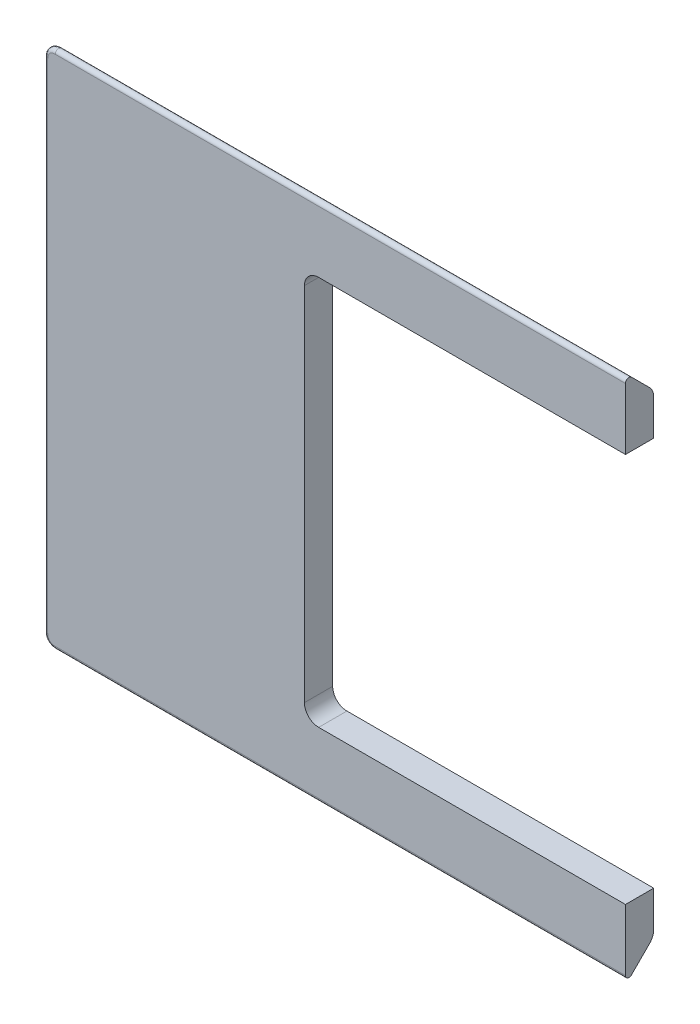
ISO-10303-21;
HEADER;
FILE_DESCRIPTION(('STEP AP214'),'2;1');
FILE_NAME('part.step','',(''),(''),'','','');
FILE_SCHEMA(('AUTOMOTIVE_DESIGN { 1 0 10303 214 1 1 1 1 }'));
ENDSEC;
DATA;
#1=APPLICATION_CONTEXT('core data for automotive mechanical design processes');
#2=APPLICATION_PROTOCOL_DEFINITION('international standard','automotive_design',2000,#1);
#3=PRODUCT_CONTEXT('',#1,'mechanical');
#4=PRODUCT('Part','Part','',(#3));
#5=PRODUCT_RELATED_PRODUCT_CATEGORY('part','',(#4));
#6=PRODUCT_DEFINITION_FORMATION('','',#4);
#7=PRODUCT_DEFINITION_CONTEXT('part definition',#1,'design');
#8=PRODUCT_DEFINITION('design','',#6,#7);
#9=PRODUCT_DEFINITION_SHAPE('','',#8);
#10=(LENGTH_UNIT() NAMED_UNIT(*) SI_UNIT(.MILLI.,.METRE.));
#11=(NAMED_UNIT(*) PLANE_ANGLE_UNIT() SI_UNIT($,.RADIAN.));
#12=(NAMED_UNIT(*) SI_UNIT($,.STERADIAN.) SOLID_ANGLE_UNIT());
#13=UNCERTAINTY_MEASURE_WITH_UNIT(LENGTH_MEASURE(1.E-05),#10,'distance_accuracy_value','');
#14=(GEOMETRIC_REPRESENTATION_CONTEXT(3) GLOBAL_UNCERTAINTY_ASSIGNED_CONTEXT((#13)) GLOBAL_UNIT_ASSIGNED_CONTEXT((#10,
#11,#12)) REPRESENTATION_CONTEXT('',''));
#15=CARTESIAN_POINT('',(0.,0.,0.));
#16=DIRECTION('',(0.,0.,1.));
#17=DIRECTION('',(1.,0.,0.));
#18=AXIS2_PLACEMENT_3D('',#15,#16,#17);
#19=CARTESIAN_POINT('',(-3.00496428663334,-69.8231491568325,36.6728417155403));
#20=CARTESIAN_POINT('',(-3.0049642866328,-69.6417599665671,36.6728417155394));
#21=CARTESIAN_POINT('',(-2.94169411988399,-69.3107853670417,36.6728417155379));
#22=CARTESIAN_POINT('',(-2.62026495891638,-68.8928204622767,36.6728417155359));
#23=CARTESIAN_POINT('',(-2.22699450196718,-68.7730955867716,36.6728417155354));
#24=CARTESIAN_POINT('',(-1.95491071656874,-68.7730955867714,36.6728417155354));
#25=CARTESIAN_POINT('',(-3.11604202688526,-69.8231491568321,36.6728417155403));
#26=CARTESIAN_POINT('',(-3.11874544267914,-69.6289801714833,36.6728860846063));
#27=CARTESIAN_POINT('',(-3.05717731561895,-69.2651335654739,36.6729506764739));
#28=CARTESIAN_POINT('',(-2.68916523885976,-68.7830387092416,36.6729798260699));
#29=CARTESIAN_POINT('',(-2.24616419459224,-68.6579627228283,36.6729082691352));
#30=CARTESIAN_POINT('',(-1.95491071656882,-68.6620178465197,36.6728417155349));
#31=CARTESIAN_POINT('',(-3.33797296559265,-69.8231491568319,36.595153565734));
#32=CARTESIAN_POINT('',(-3.34607701863612,-69.6034179349615,36.5911989278276));
#33=CARTESIAN_POINT('',(-3.28797598094053,-69.1739449843441,36.5842014219234));
#34=CARTESIAN_POINT('',(-2.82680672200666,-68.5636316265411,36.5812229193344));
#35=CARTESIAN_POINT('',(-2.28450754937456,-68.4279308282474,36.5892216088699));
#36=CARTESIAN_POINT('',(-1.95491071656898,-68.4400869078132,36.5951535657278));
#37=CARTESIAN_POINT('',(-3.50968083144635,-69.8231491568326,36.3215003048124));
#38=CARTESIAN_POINT('',(-3.51571206277398,-69.5836147494334,36.3059013845933));
#39=CARTESIAN_POINT('',(-3.44727777278209,-69.1085180758411,36.2790321294264));
#40=CARTESIAN_POINT('',(-2.92049494913923,-68.4159585207845,36.2678463301518));
#41=CARTESIAN_POINT('',(-2.31421232766808,-68.2593321949684,36.2981019244797));
#42=CARTESIAN_POINT('',(-1.9549107165691,-68.2683790419606,36.3215003048065));
#43=CARTESIAN_POINT('',(-3.5009973500986,-69.823149156834,36.0348337081705));
#44=CARTESIAN_POINT('',(-3.49552275177714,-69.5846419368623,36.0120697821309));
#45=CARTESIAN_POINT('',(-3.40415970385293,-69.121168241449,35.9747058155872));
#46=CARTESIAN_POINT('',(-2.89268977031777,-68.4633909706156,35.9597698201485));
#47=CARTESIAN_POINT('',(-2.31267154652697,-68.28527442079,36.0006878191078));
#48=CARTESIAN_POINT('',(-1.95491071656909,-68.2770625233087,36.0348337081653));
#49=CARTESIAN_POINT('',(-3.41389001084896,-69.8231491568349,35.8867317263812));
#50=CARTESIAN_POINT('',(-3.39859972627252,-69.5946289625485,35.8646262894568));
#51=CARTESIAN_POINT('',(-3.29151917534255,-69.1630700849447,35.8304125853742));
#52=CARTESIAN_POINT('',(-2.8240975646465,-68.5744360054401,35.817462641883));
#53=CARTESIAN_POINT('',(-2.29769100799933,-68.3871052894218,35.8535735709916));
#54=CARTESIAN_POINT('',(-1.95491071656903,-68.3641698625581,35.8867317263763));
#55=CARTESIAN_POINT('',(-3.3549821433207,-69.8231491568354,35.827823858853));
#56=CARTESIAN_POINT('',(-3.33482778884606,-69.6014512576221,35.8076695043779));
#57=CARTESIAN_POINT('',(-3.22072262953946,-69.1898967285637,35.7779245674011));
#58=CARTESIAN_POINT('',(-2.78142422116171,-68.6433363826317,35.7671983736439));
#59=CARTESIAN_POINT('',(-2.28745756538958,-68.4533092617972,35.7975923271375));
#60=CARTESIAN_POINT('',(-1.95491071656899,-68.4230777300862,35.8278238588482));
#61=B_SPLINE_SURFACE_WITH_KNOTS('',3,3,((#19,#20,#21,#22,#23,#24),(#25,#26,#27,#28,#29,#30),
(#31,#32,#33,#34,#35,#36),(#37,#38,#39,#40,#41,#42),(#43,#44,#45,#46,#47,#48),(#49,#50,#51,#52,
#53,#54),(#55,#56,#57,#58,#59,#60)),.UNSPECIFIED.,.F.,.F.,.F.,(4,1,1,1,4),(4,1,1,4),(0.,
0.285714285714286,0.571428571428571,0.785714285714286,1.),(-0.523598775597764,
-0.224399475255628,0.0747998250865082,0.523598775599713),.UNSPECIFIED.);
#62=CARTESIAN_POINT('',(-3.00496428663334,-69.8231491568325,36.6728417155403));
#63=CARTESIAN_POINT('',(-3.0049642866328,-69.6417599665671,36.6728417155394));
#64=CARTESIAN_POINT('',(-2.94169411988399,-69.3107853670417,36.6728417155379));
#65=CARTESIAN_POINT('',(-2.62026495891638,-68.8928204622767,36.6728417155359));
#66=CARTESIAN_POINT('',(-2.22699450196718,-68.7730955867716,36.6728417155354));
#67=CARTESIAN_POINT('',(-1.95491071656874,-68.7730955867714,36.6728417155354));
#68=B_SPLINE_CURVE_WITH_KNOTS('',3,(#62,#63,#64,#65,#66,#67),.UNSPECIFIED.,.F.,.F.,(4,1,1,4),
(-0.523598775597764,-0.224399475255628,0.0747998250865082,0.523598775599713),.UNSPECIFIED.);
#69=CARTESIAN_POINT('',(-1.95491071656881,-68.7730955867729,36.6728417155354));
#70=VERTEX_POINT('',#69);
#71=CARTESIAN_POINT('',(-3.00496428663383,-69.8231491568325,36.6728417155403));
#72=VERTEX_POINT('',#71);
#73=EDGE_CURVE('E481',#70,#72,#68,.F.);
#74=CARTESIAN_POINT('',(-1.95491071656874,-68.7730955867714,36.6728417155354));
#75=CARTESIAN_POINT('',(-1.95491071656882,-68.6620178465197,36.6728417155349));
#76=CARTESIAN_POINT('',(-1.95491071656898,-68.4400869078132,36.5951535657278));
#77=CARTESIAN_POINT('',(-1.9549107165691,-68.2683790419606,36.3215003048065));
#78=CARTESIAN_POINT('',(-1.95491071656909,-68.2770625233087,36.0348337081653));
#79=CARTESIAN_POINT('',(-1.95491071656903,-68.3641698625581,35.8867317263763));
#80=CARTESIAN_POINT('',(-1.95491071656899,-68.4230777300862,35.8278238588482));
#81=B_SPLINE_CURVE_WITH_KNOTS('',3,(#74,#75,#76,#77,#78,#79,#80),.UNSPECIFIED.,.F.,.F.,(4,1,1,1,
4),(0.,0.285714285714286,0.571428571428571,0.785714285714286,1.),.UNSPECIFIED.);
#82=CARTESIAN_POINT('',(-1.9549107165689,-68.423077730088,35.8278238588481));
#83=VERTEX_POINT('',#82);
#84=EDGE_CURVE('E338',#83,#70,#81,.F.);
#85=CARTESIAN_POINT('',(-1.95491071656899,-68.4230777300862,35.8278238588482));
#86=CARTESIAN_POINT('',(-2.28745756538958,-68.4533092617972,35.7975923271375));
#87=CARTESIAN_POINT('',(-2.78142422116171,-68.6433363826317,35.7671983736439));
#88=CARTESIAN_POINT('',(-3.22072262953946,-69.1898967285637,35.7779245674011));
#89=CARTESIAN_POINT('',(-3.33482778884606,-69.6014512576221,35.8076695043779));
#90=CARTESIAN_POINT('',(-3.3549821433207,-69.8231491568354,35.827823858853));
#91=B_SPLINE_CURVE_WITH_KNOTS('',3,(#85,#86,#87,#88,#89,#90),.UNSPECIFIED.,.F.,.F.,(4,1,1,4),
(-0.523598775597764,-0.0747998250845592,0.224399475257577,0.523598775599713),.UNSPECIFIED.);
#92=CARTESIAN_POINT('',(-3.35498214334945,-69.82314915678,35.8278238588801));
#93=VERTEX_POINT('',#92);
#94=EDGE_CURVE('E482',#93,#83,#91,.F.);
#95=CARTESIAN_POINT('',(-3.3549821433207,-69.8231491568354,35.827823858853));
#96=CARTESIAN_POINT('',(-3.41389001084896,-69.8231491568349,35.8867317263812));
#97=CARTESIAN_POINT('',(-3.5009973500986,-69.823149156834,36.0348337081705));
#98=CARTESIAN_POINT('',(-3.50968083144635,-69.8231491568326,36.3215003048124));
#99=CARTESIAN_POINT('',(-3.33797296559265,-69.8231491568319,36.595153565734));
#100=CARTESIAN_POINT('',(-3.11604202688526,-69.8231491568321,36.6728417155403));
#101=CARTESIAN_POINT('',(-3.00496428663334,-69.8231491568325,36.6728417155403));
#102=B_SPLINE_CURVE_WITH_KNOTS('',3,(#95,#96,#97,#98,#99,#100,#101),.UNSPECIFIED.,.F.,.F.,(4,1,
1,1,4),(0.,0.214285714285714,0.428571428571429,0.714285714285714,1.),.UNSPECIFIED.);
#103=EDGE_CURVE('E479',#72,#93,#102,.F.);
#104=ORIENTED_EDGE('',*,*,#73,.F.);
#105=ORIENTED_EDGE('',*,*,#84,.F.);
#106=ORIENTED_EDGE('',*,*,#94,.F.);
#107=ORIENTED_EDGE('',*,*,#103,.F.);
#108=EDGE_LOOP('',(#104,#105,#106,#107));
#109=FACE_BOUND('',#108,.T.);
#110=ADVANCED_FACE('F17',(#109),#61,.F.);
#111=CARTESIAN_POINT('',(0.580142853498731,-72.3582027269058,34.6928417155298));
#112=DIRECTION('',(-0.270598050073099,0.270598050073099,-0.923879532511287));
#113=DIRECTION('',(0.959682982260667,0.,-0.281084637714821));
#114=AXIS2_PLACEMENT_3D('',#111,#112,#113);
#115=SPHERICAL_SURFACE('',#114,1.98);
#116=CARTESIAN_POINT('',(0.0443587143539955,-71.8224185877611,32.8635602411575));
#117=VERTEX_POINT('',#116);
#118=VERTEX_LOOP('',#117);
#119=FACE_BOUND('',#118,.T.);
#120=CARTESIAN_POINT('',(0.580142853498731,-72.3582027269058,34.6928417155298));
#121=DIRECTION('',(1.,0.,0.));
#122=DIRECTION('',(0.,0.,-1.));
#123=AXIS2_PLACEMENT_3D('',#120,#121,#122);
#124=CIRCLE('',#123,1.98);
#125=CARTESIAN_POINT('',(0.580142853498721,-70.9581313001564,33.2927702887805));
#126=VERTEX_POINT('',#125);
#127=CARTESIAN_POINT('',(0.580142853498731,-72.3582027269058,32.7128417155298));
#128=VERTEX_POINT('',#127);
#129=EDGE_CURVE('E24',#126,#128,#124,.F.);
#130=ORIENTED_EDGE('',*,*,#129,.T.);
#131=CARTESIAN_POINT('',(0.580142853498731,-72.3582027269058,34.6928417155298));
#132=DIRECTION('',(0.,-1.,0.));
#133=DIRECTION('',(0.,0.,-1.));
#134=AXIS2_PLACEMENT_3D('',#131,#132,#133);
#135=CIRCLE('',#134,1.98);
#136=CARTESIAN_POINT('',(-0.819928573250653,-72.3582027269058,33.2927702887805));
#137=VERTEX_POINT('',#136);
#138=EDGE_CURVE('E500',#128,#137,#135,.F.);
#139=ORIENTED_EDGE('',*,*,#138,.T.);
#140=CARTESIAN_POINT('',(0.580142853498698,-72.3582027269058,34.6928417155298));
#141=DIRECTION('',(0.577350269189626,-0.577350269189625,-0.577350269189626));
#142=DIRECTION('',(-0.707106781186547,0.,-0.707106781186547));
#143=AXIS2_PLACEMENT_3D('',#140,#141,#142);
#144=CIRCLE('',#143,1.98);
#145=EDGE_CURVE('E485',#126,#137,#144,.F.);
#146=ORIENTED_EDGE('',*,*,#145,.F.);
#147=EDGE_LOOP('',(#130,#139,#146));
#148=FACE_BOUND('',#147,.T.);
#149=ADVANCED_FACE('F301',(#119,#148),#115,.T.);
#150=CARTESIAN_POINT('',(-1.95491071690341,-140.633024160384,36.6728417158714));
#151=CARTESIAN_POINT('',(-2.22699450230281,-140.633024160384,36.6728417158714));
#152=CARTESIAN_POINT('',(-2.62025383510631,-140.513284038942,36.6728417158709));
#153=CARTESIAN_POINT('',(-2.94168802214441,-140.095326470196,36.6728417158689));
#154=CARTESIAN_POINT('',(-3.00496428696518,-139.764359780586,36.6728417158673));
#155=CARTESIAN_POINT('',(-3.00496428696446,-139.582970590319,36.6728417158665));
#156=CARTESIAN_POINT('',(-1.95491071690321,-140.744101900636,36.6728417158719));
#157=CARTESIAN_POINT('',(-2.24616419492771,-140.748157024328,36.6729082694723));
#158=CARTESIAN_POINT('',(-2.68920792701886,-140.623045714494,36.6729922075104));
#159=CARTESIAN_POINT('',(-3.0572039477673,-140.140971717587,36.672958956598));
#160=CARTESIAN_POINT('',(-3.11874544301159,-139.777139575668,36.6728860849343));
#161=CARTESIAN_POINT('',(-3.11604202721637,-139.582970590319,36.6728417158665));
#162=CARTESIAN_POINT('',(-1.95491071690283,-140.966031054386,36.595144452796));
#163=CARTESIAN_POINT('',(-2.28450754970972,-140.978187133953,36.589212495938));
#164=CARTESIAN_POINT('',(-2.82696347593654,-140.842421339197,36.5812107983052));
#165=CARTESIAN_POINT('',(-3.28807399838253,-140.232150673551,36.5841898209763));
#166=CARTESIAN_POINT('',(-3.34607523401095,-139.802701812189,36.5911898148856));
#167=CARTESIAN_POINT('',(-3.33797118096597,-139.582970590318,36.5951444527899));
#168=CARTESIAN_POINT('',(-1.95491071690254,-141.137737082671,36.3214961519573));
#169=CARTESIAN_POINT('',(-2.31421232800284,-141.146783929665,36.2980977716301));
#170=CARTESIAN_POINT('',(-2.92070150272886,-140.990089968671,36.2678448666628));
#171=CARTESIAN_POINT('',(-3.44740901166946,-140.297576884246,36.2790281626689));
#172=CARTESIAN_POINT('',(-3.51570844057935,-139.822504997719,36.3058972317345));
#173=CARTESIAN_POINT('',(-3.50967720925006,-139.582970590319,36.3214961519514));
#174=CARTESIAN_POINT('',(-1.95491071690255,-141.129051708278,36.034831063988));
#175=CARTESIAN_POINT('',(-2.31267154686145,-141.120839810798,36.0006851749299));
#176=CARTESIAN_POINT('',(-2.89280598781092,-140.942665083103,35.9597609089001));
#177=CARTESIAN_POINT('',(-3.40423096759155,-140.284926243157,35.9746972257442));
#178=CARTESIAN_POINT('',(-3.49551723653683,-139.821477810293,36.0120671379453));
#179=CARTESIAN_POINT('',(-3.50099183485664,-139.58297059032,36.0348310639828));
#180=CARTESIAN_POINT('',(-1.9549107169027,-141.041949884602,35.8867317267125));
#181=CARTESIAN_POINT('',(-2.29769100833374,-141.019014457739,35.8535735713271));
#182=CARTESIAN_POINT('',(-2.82414213081282,-140.831665166817,35.8174643697151));
#183=CARTESIAN_POINT('',(-3.29155106943329,-140.243042040226,35.8304127615578));
#184=CARTESIAN_POINT('',(-3.39859972660533,-139.811490784609,35.8646262897853));
#185=CARTESIAN_POINT('',(-3.41389001118018,-139.582970590321,35.8867317267076));
#186=CARTESIAN_POINT('',(-1.9549107169028,-140.983042017073,35.8278238591841));
#187=CARTESIAN_POINT('',(-2.28745756572399,-140.952810485363,35.7975923274728));
#188=CARTESIAN_POINT('',(-2.78141231931042,-140.762765966622,35.767201303988));
#189=CARTESIAN_POINT('',(-3.22071605555198,-140.216214028485,35.7779261241758));
#190=CARTESIAN_POINT('',(-3.33482778917884,-139.804668489536,35.8076695047063));
#191=CARTESIAN_POINT('',(-3.35498214365196,-139.582970590322,35.8278238591793));
#192=B_SPLINE_SURFACE_WITH_KNOTS('',3,3,((#150,#151,#152,#153,#154,#155),(#156,#157,#158,#159,
#160,#161),(#162,#163,#164,#165,#166,#167),(#168,#169,#170,#171,#172,#173),(#174,#175,#176,#177,
#178,#179),(#180,#181,#182,#183,#184,#185),(#186,#187,#188,#189,#190,#191)),.UNSPECIFIED.,.F.,
.F.,.F.,(4,1,1,1,4),(4,1,1,4),(0.,0.285714285714286,0.571428571428571,0.785714285714286,1.),
(-0.523598775597767,-0.0747998250845623,0.224399475257574,0.523598775599711),.UNSPECIFIED.);
#193=CARTESIAN_POINT('',(-1.95491071690341,-140.633024160384,36.6728417158714));
#194=CARTESIAN_POINT('',(-2.22699450230281,-140.633024160384,36.6728417158714));
#195=CARTESIAN_POINT('',(-2.62025383510631,-140.513284038942,36.6728417158709));
#196=CARTESIAN_POINT('',(-2.94168802214441,-140.095326470196,36.6728417158689));
#197=CARTESIAN_POINT('',(-3.00496428696518,-139.764359780586,36.6728417158673));
#198=CARTESIAN_POINT('',(-3.00496428696446,-139.582970590319,36.6728417158665));
#199=B_SPLINE_CURVE_WITH_KNOTS('',3,(#193,#194,#195,#196,#197,#198),.UNSPECIFIED.,.F.,.F.,(4,1,
1,4),(-0.523598775597767,-0.0747998250845623,0.224399475257574,0.523598775599711),.UNSPECIFIED.);
#200=CARTESIAN_POINT('',(-3.00496428696299,-139.582970590319,36.6728417158665));
#201=VERTEX_POINT('',#200);
#202=CARTESIAN_POINT('',(-1.95491071690341,-140.633024160384,36.6728417158714));
#203=VERTEX_POINT('',#202);
#204=EDGE_CURVE('E444',#201,#203,#199,.F.);
#205=CARTESIAN_POINT('',(-3.00496428696446,-139.582970590319,36.6728417158665));
#206=CARTESIAN_POINT('',(-3.11604202721637,-139.582970590319,36.6728417158665));
#207=CARTESIAN_POINT('',(-3.33797118096597,-139.582970590318,36.5951444527899));
#208=CARTESIAN_POINT('',(-3.50967720925006,-139.582970590319,36.3214961519514));
#209=CARTESIAN_POINT('',(-3.50099183485664,-139.58297059032,36.0348310639828));
#210=CARTESIAN_POINT('',(-3.41389001118018,-139.582970590321,35.8867317267076));
#211=CARTESIAN_POINT('',(-3.35498214365196,-139.582970590322,35.8278238591793));
#212=B_SPLINE_CURVE_WITH_KNOTS('',3,(#205,#206,#207,#208,#209,#210,#211),.UNSPECIFIED.,.F.,.F.,
(4,1,1,1,4),(0.,0.285714285714286,0.571428571428571,0.785714285714286,1.),.UNSPECIFIED.);
#213=CARTESIAN_POINT('',(-3.35498214365021,-139.582970590322,35.8278238591792));
#214=VERTEX_POINT('',#213);
#215=EDGE_CURVE('E449',#214,#201,#212,.F.);
#216=CARTESIAN_POINT('',(-3.35498214365196,-139.582970590322,35.8278238591793));
#217=CARTESIAN_POINT('',(-3.33482778917884,-139.804668489536,35.8076695047063));
#218=CARTESIAN_POINT('',(-3.22071605555198,-140.216214028485,35.7779261241758));
#219=CARTESIAN_POINT('',(-2.78141231931042,-140.762765966622,35.767201303988));
#220=CARTESIAN_POINT('',(-2.28745756572399,-140.952810485363,35.7975923274728));
#221=CARTESIAN_POINT('',(-1.9549107169028,-140.983042017073,35.8278238591841));
#222=B_SPLINE_CURVE_WITH_KNOTS('',3,(#216,#217,#218,#219,#220,#221),.UNSPECIFIED.,.F.,.F.,(4,1,
1,4),(-0.523598775597767,-0.22439947525563,0.0747998250865063,0.523598775599711),.UNSPECIFIED.);
#223=CARTESIAN_POINT('',(-1.95491071690361,-140.983042017075,35.8278238591841));
#224=VERTEX_POINT('',#223);
#225=EDGE_CURVE('E241',#224,#214,#222,.F.);
#226=CARTESIAN_POINT('',(-1.9549107169028,-140.983042017073,35.8278238591841));
#227=CARTESIAN_POINT('',(-1.9549107169027,-141.041949884602,35.8867317267125));
#228=CARTESIAN_POINT('',(-1.95491071690255,-141.129051708278,36.034831063988));
#229=CARTESIAN_POINT('',(-1.95491071690254,-141.137737082671,36.3214961519573));
#230=CARTESIAN_POINT('',(-1.95491071690283,-140.966031054386,36.595144452796));
#231=CARTESIAN_POINT('',(-1.95491071690321,-140.744101900636,36.6728417158719));
#232=CARTESIAN_POINT('',(-1.95491071690341,-140.633024160384,36.6728417158714));
#233=B_SPLINE_CURVE_WITH_KNOTS('',3,(#226,#227,#228,#229,#230,#231,#232),.UNSPECIFIED.,.F.,.F.,
(4,1,1,1,4),(0.,0.214285714285714,0.428571428571429,0.714285714285714,1.),.UNSPECIFIED.);
#234=EDGE_CURVE('E448',#203,#224,#233,.F.);
#235=ORIENTED_EDGE('',*,*,#204,.F.);
#236=ORIENTED_EDGE('',*,*,#215,.F.);
#237=ORIENTED_EDGE('',*,*,#225,.F.);
#238=ORIENTED_EDGE('',*,*,#234,.F.);
#239=EDGE_LOOP('',(#235,#236,#237,#238));
#240=FACE_BOUND('',#239,.T.);
#241=ADVANCED_FACE('F19',(#240),#192,.F.);
#242=CARTESIAN_POINT('',(0.580142853498731,-137.047917019923,34.6928417155298));
#243=DIRECTION('',(-0.270598050073095,-0.270598050073101,-0.923879532511287));
#244=DIRECTION('',(0.959682982260668,0.,-0.281084637714817));
#245=AXIS2_PLACEMENT_3D('',#242,#243,#244);
#246=SPHERICAL_SURFACE('',#245,1.98);
#247=CARTESIAN_POINT('',(0.0443587143540025,-137.583701159068,32.8635602411575));
#248=VERTEX_POINT('',#247);
#249=VERTEX_LOOP('',#248);
#250=FACE_BOUND('',#249,.T.);
#251=CARTESIAN_POINT('',(0.580142853498731,-137.047917019923,34.6928417155298));
#252=DIRECTION('',(0.,-1.,0.));
#253=DIRECTION('',(0.,0.,-1.));
#254=AXIS2_PLACEMENT_3D('',#251,#252,#253);
#255=CIRCLE('',#254,1.98);
#256=CARTESIAN_POINT('',(-0.819928573250597,-137.047917019923,33.2927702887804));
#257=VERTEX_POINT('',#256);
#258=CARTESIAN_POINT('',(0.580142853498737,-137.047917019923,32.7128417155298));
#259=VERTEX_POINT('',#258);
#260=EDGE_CURVE('E451',#257,#259,#255,.T.);
#261=ORIENTED_EDGE('',*,*,#260,.T.);
#262=CARTESIAN_POINT('',(0.580142853498743,-137.047917019923,34.6928417155298));
#263=DIRECTION('',(-1.,0.,0.));
#264=DIRECTION('',(0.,0.,1.));
#265=AXIS2_PLACEMENT_3D('',#262,#263,#264);
#266=CIRCLE('',#265,1.98);
#267=CARTESIAN_POINT('',(0.58014285349877,-138.447988446672,33.2927702887803));
#268=VERTEX_POINT('',#267);
#269=EDGE_CURVE('E486',#259,#268,#266,.T.);
#270=ORIENTED_EDGE('',*,*,#269,.T.);
#271=CARTESIAN_POINT('',(0.580142853498791,-137.047917019923,34.6928417155298));
#272=DIRECTION('',(-0.577350269189625,-0.577350269189628,0.577350269189625));
#273=DIRECTION('',(0.,-0.707106781186546,-0.707106781186549));
#274=AXIS2_PLACEMENT_3D('',#271,#272,#273);
#275=CIRCLE('',#274,1.98);
#276=EDGE_CURVE('E506',#257,#268,#275,.T.);
#277=ORIENTED_EDGE('',*,*,#276,.F.);
#278=EDGE_LOOP('',(#261,#270,#277));
#279=FACE_BOUND('',#278,.T.);
#280=ADVANCED_FACE('F264',(#250,#279),#246,.T.);
#281=CARTESIAN_POINT('',(8.48963095116805,-80.2676908245751,26.7833536178605));
#282=DIRECTION('',(0.577350269189626,-0.577350269189625,-0.577350269189626));
#283=DIRECTION('',(-0.707106781186547,0.,-0.707106781186547));
#284=AXIS2_PLACEMENT_3D('',#281,#282,#283);
#285=CYLINDRICAL_SURFACE('',#284,1.98);
#286=ORIENTED_EDGE('',*,*,#145,.T.);
#287=DIRECTION('',(0.577350269189621,-0.577350269189636,-0.57735026918962));
#288=VECTOR('',#287,1.);
#289=CARTESIAN_POINT('',(-3.35498214332311,-69.8231491568333,35.8278238588529));
#290=LINE('',#289,#288);
#291=EDGE_CURVE('E282',#93,#137,#290,.T.);
#292=ORIENTED_EDGE('',*,*,#291,.F.);
#293=ORIENTED_EDGE('',*,*,#94,.T.);
#294=DIRECTION('',(-0.577350269189631,0.577350269189623,0.577350269189623));
#295=VECTOR('',#294,1.);
#296=CARTESIAN_POINT('',(0.58014285349873,-70.9581313001564,33.2927702887805));
#297=LINE('',#296,#295);
#298=EDGE_CURVE('E228',#126,#83,#297,.T.);
#299=ORIENTED_EDGE('',*,*,#298,.F.);
#300=EDGE_LOOP('',(#286,#292,#293,#299));
#301=FACE_BOUND('',#300,.T.);
#302=ADVANCED_FACE('F259',(#301),#285,.T.);
#303=CARTESIAN_POINT('',(1.64213095116686,-135.985928922255,33.6308536178617));
#304=DIRECTION('',(-0.577350269189625,-0.577350269189628,0.577350269189625));
#305=DIRECTION('',(0.,-0.707106781186546,-0.707106781186549));
#306=AXIS2_PLACEMENT_3D('',#303,#304,#305);
#307=CYLINDRICAL_SURFACE('',#306,1.98);
#308=ORIENTED_EDGE('',*,*,#276,.T.);
#309=DIRECTION('',(0.577350269189594,0.577350269189642,-0.577350269189641));
#310=VECTOR('',#309,1.);
#311=CARTESIAN_POINT('',(-1.95491071690489,-140.983042017076,35.827823859184));
#312=LINE('',#311,#310);
#313=EDGE_CURVE('E203',#224,#268,#312,.T.);
#314=ORIENTED_EDGE('',*,*,#313,.F.);
#315=ORIENTED_EDGE('',*,*,#225,.T.);
#316=DIRECTION('',(-0.577350269189609,-0.577350269189661,0.577350269189607));
#317=VECTOR('',#316,1.);
#318=CARTESIAN_POINT('',(-0.819928573250616,-137.047917019923,33.2927702887804));
#319=LINE('',#318,#317);
#320=EDGE_CURVE('E216',#257,#214,#319,.T.);
#321=ORIENTED_EDGE('',*,*,#320,.F.);
#322=EDGE_LOOP('',(#308,#314,#315,#321));
#323=FACE_BOUND('',#322,.T.);
#324=ADVANCED_FACE('F248',(#323),#307,.T.);
#325=CARTESIAN_POINT('',(0.750000000000002,-137.047917019923,34.6928417155298));
#326=DIRECTION('',(-1.,0.,0.));
#327=DIRECTION('',(0.,0.,1.));
#328=AXIS2_PLACEMENT_3D('',#325,#326,#327);
#329=CYLINDRICAL_SURFACE('',#328,1.98);
#330=ORIENTED_EDGE('',*,*,#269,.F.);
#331=DIRECTION('',(-1.,0.,0.));
#332=VECTOR('',#331,1.);
#333=CARTESIAN_POINT('',(0.750000000000002,-137.047917019923,32.7128417155298));
#334=LINE('',#333,#332);
#335=CARTESIAN_POINT('',(77.97,-137.047917019923,32.7128417155298));
#336=VERTEX_POINT('',#335);
#337=EDGE_CURVE('E196',#336,#259,#334,.T.);
#338=ORIENTED_EDGE('',*,*,#337,.F.);
#339=CARTESIAN_POINT('',(77.97,-137.047917019923,34.6928417155298));
#340=DIRECTION('',(-1.,0.,0.));
#341=DIRECTION('',(0.,0.,1.));
#342=AXIS2_PLACEMENT_3D('',#339,#340,#341);
#343=CIRCLE('',#342,1.98);
#344=CARTESIAN_POINT('',(77.97,-138.447988446672,33.2927702887803));
#345=VERTEX_POINT('',#344);
#346=EDGE_CURVE('E508',#336,#345,#343,.T.);
#347=ORIENTED_EDGE('',*,*,#346,.T.);
#348=DIRECTION('',(1.,0.,0.));
#349=VECTOR('',#348,1.);
#350=CARTESIAN_POINT('',(0.750000000000002,-138.447988446672,33.2927702887801));
#351=LINE('',#350,#349);
#352=EDGE_CURVE('E200',#268,#345,#351,.T.);
#353=ORIENTED_EDGE('',*,*,#352,.F.);
#354=EDGE_LOOP('',(#330,#338,#347,#353));
#355=FACE_BOUND('',#354,.T.);
#356=ADVANCED_FACE('F258',(#355),#329,.T.);
#357=CARTESIAN_POINT('',(0.580142853498731,-129.57680987342,34.6928417155298));
#358=DIRECTION('',(0.,-1.,0.));
#359=DIRECTION('',(0.,0.,-1.));
#360=AXIS2_PLACEMENT_3D('',#357,#358,#359);
#361=CYLINDRICAL_SURFACE('',#360,1.98);
#362=ORIENTED_EDGE('',*,*,#138,.F.);
#363=DIRECTION('',(0.,1.,0.));
#364=VECTOR('',#363,1.);
#365=CARTESIAN_POINT('',(0.580142853498731,-137.868059873422,32.7128417155298));
#366=LINE('',#365,#364);
#367=EDGE_CURVE('E199',#259,#128,#366,.T.);
#368=ORIENTED_EDGE('',*,*,#367,.F.);
#369=ORIENTED_EDGE('',*,*,#260,.F.);
#370=DIRECTION('',(0.,1.,0.));
#371=VECTOR('',#370,1.);
#372=CARTESIAN_POINT('',(-0.819928573250666,-121.285559873418,33.2927702887805));
#373=LINE('',#372,#371);
#374=EDGE_CURVE('E491',#137,#257,#373,.F.);
#375=ORIENTED_EDGE('',*,*,#374,.F.);
#376=EDGE_LOOP('',(#362,#368,#369,#375));
#377=FACE_BOUND('',#376,.T.);
#378=ADVANCED_FACE('F405',(#377),#361,.T.);
#379=CARTESIAN_POINT('',(0.750000000000002,-72.3582027269058,34.6928417155298));
#380=DIRECTION('',(1.,0.,0.));
#381=DIRECTION('',(0.,0.,-1.));
#382=AXIS2_PLACEMENT_3D('',#379,#380,#381);
#383=CYLINDRICAL_SURFACE('',#382,1.98);
#384=ORIENTED_EDGE('',*,*,#129,.F.);
#385=DIRECTION('',(1.,0.,0.));
#386=VECTOR('',#385,1.);
#387=CARTESIAN_POINT('',(0.750000000000002,-70.9581313001564,33.2927702887805));
#388=LINE('',#387,#386);
#389=CARTESIAN_POINT('',(77.97,-70.9581313001564,33.2927702887805));
#390=VERTEX_POINT('',#389);
#391=EDGE_CURVE('E225',#390,#126,#388,.F.);
#392=ORIENTED_EDGE('',*,*,#391,.F.);
#393=CARTESIAN_POINT('',(77.97,-72.3582027269058,34.6928417155298));
#394=DIRECTION('',(1.,0.,0.));
#395=DIRECTION('',(0.,0.,-1.));
#396=AXIS2_PLACEMENT_3D('',#393,#394,#395);
#397=CIRCLE('',#396,1.98);
#398=CARTESIAN_POINT('',(77.97,-72.3582027269058,32.7128417155298));
#399=VERTEX_POINT('',#398);
#400=EDGE_CURVE('E229',#390,#399,#397,.F.);
#401=ORIENTED_EDGE('',*,*,#400,.T.);
#402=DIRECTION('',(-1.,0.,0.));
#403=VECTOR('',#402,1.);
#404=CARTESIAN_POINT('',(0.750000000000002,-72.3582027269058,32.7128417155298));
#405=LINE('',#404,#403);
#406=EDGE_CURVE('E173',#128,#399,#405,.F.);
#407=ORIENTED_EDGE('',*,*,#406,.F.);
#408=EDGE_LOOP('',(#384,#392,#401,#407));
#409=FACE_BOUND('',#408,.T.);
#410=ADVANCED_FACE('F402',(#409),#383,.T.);
#411=CARTESIAN_POINT('',(0.750000000000002,-71.5380598734071,32.7128417155298));
#412=DIRECTION('',(0.,0.707106781186548,-0.707106781186547));
#413=DIRECTION('',(0.,0.707106781186547,0.707106781186548));
#414=AXIS2_PLACEMENT_3D('',#411,#412,#413);
#415=PLANE('',#414);
#416=ORIENTED_EDGE('',*,*,#391,.T.);
#417=ORIENTED_EDGE('',*,*,#298,.T.);
#418=DIRECTION('',(1.,0.,0.));
#419=VECTOR('',#418,1.);
#420=CARTESIAN_POINT('',(0.750000000000002,-68.4230777300889,35.827823858848));
#421=LINE('',#420,#419);
#422=CARTESIAN_POINT('',(77.97,-68.4230777300888,35.827823858848));
#423=VERTEX_POINT('',#422);
#424=EDGE_CURVE('E219',#423,#83,#421,.F.);
#425=ORIENTED_EDGE('',*,*,#424,.F.);
#426=DIRECTION('',(0.,0.70710678118656,0.707106781186535));
#427=VECTOR('',#426,1.);
#428=CARTESIAN_POINT('',(77.97,-70.9581313001564,33.2927702887805));
#429=LINE('',#428,#427);
#430=EDGE_CURVE('E175',#390,#423,#429,.T.);
#431=ORIENTED_EDGE('',*,*,#430,.F.);
#432=EDGE_LOOP('',(#416,#417,#425,#431));
#433=FACE_BOUND('',#432,.T.);
#434=ADVANCED_FACE('F398',(#433),#415,.T.);
#435=CARTESIAN_POINT('',(-2.22,-121.285559873418,34.6928417155298));
#436=DIRECTION('',(-0.707106781186547,0.,-0.707106781186548));
#437=DIRECTION('',(-0.707106781186548,0.,0.707106781186547));
#438=AXIS2_PLACEMENT_3D('',#435,#436,#437);
#439=PLANE('',#438);
#440=ORIENTED_EDGE('',*,*,#374,.T.);
#441=ORIENTED_EDGE('',*,*,#320,.T.);
#442=DIRECTION('',(4.67625937972116E-12,1.,-4.67625937972116E-12));
#443=VECTOR('',#442,1.);
#444=CARTESIAN_POINT('',(-3.35498214343817,-94.4318098733996,35.827823858968));
#445=LINE('',#444,#443);
#446=EDGE_CURVE('E207',#93,#214,#445,.F.);
#447=ORIENTED_EDGE('',*,*,#446,.F.);
#448=ORIENTED_EDGE('',*,*,#291,.T.);
#449=EDGE_LOOP('',(#440,#441,#447,#448));
#450=FACE_BOUND('',#449,.T.);
#451=ADVANCED_FACE('F394',(#450),#439,.T.);
#452=CARTESIAN_POINT('',(0.750000000000002,-141.828059873422,36.6728417155298));
#453=DIRECTION('',(0.,-0.707106781186546,-0.707106781186549));
#454=DIRECTION('',(0.,0.707106781186549,-0.707106781186546));
#455=AXIS2_PLACEMENT_3D('',#452,#453,#454);
#456=PLANE('',#455);
#457=ORIENTED_EDGE('',*,*,#352,.T.);
#458=DIRECTION('',(0.,0.707106781186587,-0.707106781186508));
#459=VECTOR('',#458,1.);
#460=CARTESIAN_POINT('',(77.97,-140.983042017076,35.8278238591841));
#461=LINE('',#460,#459);
#462=CARTESIAN_POINT('',(77.97,-140.983042017076,35.8278238591841));
#463=VERTEX_POINT('',#462);
#464=EDGE_CURVE('E523',#463,#345,#461,.T.);
#465=ORIENTED_EDGE('',*,*,#464,.F.);
#466=DIRECTION('',(1.,0.,0.));
#467=VECTOR('',#466,1.);
#468=CARTESIAN_POINT('',(0.750000000000002,-140.983042017076,35.8278238591844));
#469=LINE('',#468,#467);
#470=EDGE_CURVE('E204',#224,#463,#469,.T.);
#471=ORIENTED_EDGE('',*,*,#470,.F.);
#472=ORIENTED_EDGE('',*,*,#313,.T.);
#473=EDGE_LOOP('',(#457,#465,#471,#472));
#474=FACE_BOUND('',#473,.T.);
#475=ADVANCED_FACE('F391',(#474),#456,.T.);
#476=CARTESIAN_POINT('',(0.750000000000002,-137.868059873422,32.7128417155298));
#477=DIRECTION('',(0.,0.,-1.));
#478=DIRECTION('',(-1.,0.,0.));
#479=AXIS2_PLACEMENT_3D('',#476,#477,#478);
#480=PLANE('',#479);
#481=DIRECTION('',(0.,-1.,0.));
#482=VECTOR('',#481,1.);
#483=CARTESIAN_POINT('',(32.97,-77.3931313001565,32.7128417155298));
#484=LINE('',#483,#482);
#485=CARTESIAN_POINT('',(32.97,-79.3931313001565,32.7128417155298));
#486=VERTEX_POINT('',#485);
#487=CARTESIAN_POINT('',(32.97,-130.012988446672,32.7128417155298));
#488=VERTEX_POINT('',#487);
#489=EDGE_CURVE('E192',#486,#488,#484,.T.);
#490=ORIENTED_EDGE('',*,*,#489,.T.);
#491=CARTESIAN_POINT('',(34.97,-130.012988446672,32.7128417155298));
#492=DIRECTION('',(0.,0.,1.));
#493=DIRECTION('',(1.,0.,0.));
#494=AXIS2_PLACEMENT_3D('',#491,#492,#493);
#495=CIRCLE('',#494,2.);
#496=CARTESIAN_POINT('',(34.97,-132.012988446672,32.7128417155298));
#497=VERTEX_POINT('',#496);
#498=EDGE_CURVE('E194',#488,#497,#495,.T.);
#499=ORIENTED_EDGE('',*,*,#498,.T.);
#500=DIRECTION('',(1.,0.,0.));
#501=VECTOR('',#500,1.);
#502=CARTESIAN_POINT('',(32.97,-132.012988446672,32.7128417155298));
#503=LINE('',#502,#501);
#504=CARTESIAN_POINT('',(77.97,-132.012988446672,32.7128417155298));
#505=VERTEX_POINT('',#504);
#506=EDGE_CURVE('E195',#497,#505,#503,.T.);
#507=ORIENTED_EDGE('',*,*,#506,.T.);
#508=DIRECTION('',(0.,1.,0.));
#509=VECTOR('',#508,1.);
#510=CARTESIAN_POINT('',(77.97,-104.703059873414,32.7128417155298));
#511=LINE('',#510,#509);
#512=EDGE_CURVE('E529',#336,#505,#511,.T.);
#513=ORIENTED_EDGE('',*,*,#512,.F.);
#514=ORIENTED_EDGE('',*,*,#337,.T.);
#515=ORIENTED_EDGE('',*,*,#367,.T.);
#516=ORIENTED_EDGE('',*,*,#406,.T.);
#517=DIRECTION('',(0.,1.,0.));
#518=VECTOR('',#517,1.);
#519=CARTESIAN_POINT('',(77.97,-104.703059873414,32.7128417155298));
#520=LINE('',#519,#518);
#521=CARTESIAN_POINT('',(77.97,-77.3931313001564,32.7128417155298));
#522=VERTEX_POINT('',#521);
#523=EDGE_CURVE('E170',#522,#399,#520,.T.);
#524=ORIENTED_EDGE('',*,*,#523,.F.);
#525=DIRECTION('',(-1.,0.,0.));
#526=VECTOR('',#525,1.);
#527=CARTESIAN_POINT('',(77.97,-77.3931313001564,32.7128417155298));
#528=LINE('',#527,#526);
#529=CARTESIAN_POINT('',(34.97,-77.3931313001564,32.7128417155298));
#530=VERTEX_POINT('',#529);
#531=EDGE_CURVE('E155',#522,#530,#528,.T.);
#532=ORIENTED_EDGE('',*,*,#531,.T.);
#533=CARTESIAN_POINT('',(34.97,-79.3931313001565,32.7128417155298));
#534=DIRECTION('',(0.,0.,1.));
#535=DIRECTION('',(1.,0.,0.));
#536=AXIS2_PLACEMENT_3D('',#533,#534,#535);
#537=CIRCLE('',#536,2.);
#538=EDGE_CURVE('E166',#530,#486,#537,.T.);
#539=ORIENTED_EDGE('',*,*,#538,.T.);
#540=EDGE_LOOP('',(#490,#499,#507,#513,#514,#515,#516,#524,#532,#539));
#541=FACE_BOUND('',#540,.T.);
#542=ADVANCED_FACE('F171',(#541),#480,.T.);
#543=CARTESIAN_POINT('',(32.97,-132.012988446672,32.7128417155298));
#544=DIRECTION('',(0.,-1.,0.));
#545=DIRECTION('',(1.,0.,0.));
#546=AXIS2_PLACEMENT_3D('',#543,#544,#545);
#547=PLANE('',#546);
#548=DIRECTION('',(1.,0.,0.));
#549=VECTOR('',#548,1.);
#550=CARTESIAN_POINT('',(0.750000000000002,-132.012988446672,36.6728417158311));
#551=LINE('',#550,#549);
#552=CARTESIAN_POINT('',(77.97,-132.012988446672,36.6728417158311));
#553=VERTEX_POINT('',#552);
#554=CARTESIAN_POINT('',(34.97,-132.012988446672,36.6728417158311));
#555=VERTEX_POINT('',#554);
#556=EDGE_CURVE('E148',#553,#555,#551,.F.);
#557=ORIENTED_EDGE('',*,*,#556,.F.);
#558=DIRECTION('',(0.,0.,-1.));
#559=VECTOR('',#558,1.);
#560=CARTESIAN_POINT('',(77.97,-132.012988446672,34.6928417155437));
#561=LINE('',#560,#559);
#562=EDGE_CURVE('E206',#505,#553,#561,.F.);
#563=ORIENTED_EDGE('',*,*,#562,.F.);
#564=ORIENTED_EDGE('',*,*,#506,.F.);
#565=DIRECTION('',(0.,0.,1.));
#566=VECTOR('',#565,1.);
#567=CARTESIAN_POINT('',(34.97,-132.012988446672,32.7128417155298));
#568=LINE('',#567,#566);
#569=EDGE_CURVE('E142',#497,#555,#568,.T.);
#570=ORIENTED_EDGE('',*,*,#569,.T.);
#571=EDGE_LOOP('',(#557,#563,#564,#570));
#572=FACE_BOUND('',#571,.T.);
#573=ADVANCED_FACE('F385',(#572),#547,.F.);
#574=CARTESIAN_POINT('',(34.97,-130.012988446672,32.7128417155298));
#575=DIRECTION('',(0.,0.,1.));
#576=DIRECTION('',(1.,0.,0.));
#577=AXIS2_PLACEMENT_3D('',#574,#575,#576);
#578=CYLINDRICAL_SURFACE('',#577,2.);
#579=DIRECTION('',(0.,0.,1.));
#580=VECTOR('',#579,1.);
#581=CARTESIAN_POINT('',(32.97,-130.012988446672,32.7128417155298));
#582=LINE('',#581,#580);
#583=CARTESIAN_POINT('',(32.97,-130.012988446672,36.6728417158264));
#584=VERTEX_POINT('',#583);
#585=EDGE_CURVE('E190',#488,#584,#582,.T.);
#586=ORIENTED_EDGE('',*,*,#585,.T.);
#587=CARTESIAN_POINT('',(34.97,-130.012988446672,36.6728417158311));
#588=DIRECTION('',(0.,0.,1.));
#589=DIRECTION('',(1.,0.,0.));
#590=AXIS2_PLACEMENT_3D('',#587,#588,#589);
#591=CIRCLE('',#590,2.);
#592=EDGE_CURVE('E524',#555,#584,#591,.F.);
#593=ORIENTED_EDGE('',*,*,#592,.F.);
#594=ORIENTED_EDGE('',*,*,#569,.F.);
#595=ORIENTED_EDGE('',*,*,#498,.F.);
#596=EDGE_LOOP('',(#586,#593,#594,#595));
#597=FACE_BOUND('',#596,.T.);
#598=ADVANCED_FACE('F381',(#597),#578,.F.);
#599=CARTESIAN_POINT('',(32.97,-77.3931313001565,32.7128417155298));
#600=DIRECTION('',(-1.,0.,0.));
#601=DIRECTION('',(0.,-1.,0.));
#602=AXIS2_PLACEMENT_3D('',#599,#600,#601);
#603=PLANE('',#602);
#604=ORIENTED_EDGE('',*,*,#489,.F.);
#605=DIRECTION('',(0.,0.,1.));
#606=VECTOR('',#605,1.);
#607=CARTESIAN_POINT('',(32.97,-79.3931313001565,32.7128417155298));
#608=LINE('',#607,#606);
#609=CARTESIAN_POINT('',(32.97,-79.3931313001565,36.672841715585));
#610=VERTEX_POINT('',#609);
#611=EDGE_CURVE('E188',#486,#610,#608,.T.);
#612=ORIENTED_EDGE('',*,*,#611,.T.);
#613=DIRECTION('',(0.,-1.,4.67625937972116E-12));
#614=VECTOR('',#613,1.);
#615=CARTESIAN_POINT('',(32.97,-67.5780598734071,36.6728417155298));
#616=LINE('',#615,#614);
#617=EDGE_CURVE('E526',#584,#610,#616,.F.);
#618=ORIENTED_EDGE('',*,*,#617,.F.);
#619=ORIENTED_EDGE('',*,*,#585,.F.);
#620=EDGE_LOOP('',(#604,#612,#618,#619));
#621=FACE_BOUND('',#620,.T.);
#622=ADVANCED_FACE('F377',(#621),#603,.F.);
#623=CARTESIAN_POINT('',(34.97,-79.3931313001565,32.7128417155298));
#624=DIRECTION('',(0.,0.,1.));
#625=DIRECTION('',(1.,0.,0.));
#626=AXIS2_PLACEMENT_3D('',#623,#624,#625);
#627=CYLINDRICAL_SURFACE('',#626,2.);
#628=DIRECTION('',(0.,0.,1.));
#629=VECTOR('',#628,1.);
#630=CARTESIAN_POINT('',(34.97,-77.3931313001564,32.7128417155298));
#631=LINE('',#630,#629);
#632=CARTESIAN_POINT('',(34.97,-77.3931313001564,36.6728417155803));
#633=VERTEX_POINT('',#632);
#634=EDGE_CURVE('E162',#530,#633,#631,.T.);
#635=ORIENTED_EDGE('',*,*,#634,.T.);
#636=CARTESIAN_POINT('',(34.97,-79.3931313001565,36.672841715585));
#637=DIRECTION('',(0.,0.,1.));
#638=DIRECTION('',(1.,0.,0.));
#639=AXIS2_PLACEMENT_3D('',#636,#637,#638);
#640=CIRCLE('',#639,2.);
#641=EDGE_CURVE('E355',#610,#633,#640,.F.);
#642=ORIENTED_EDGE('',*,*,#641,.F.);
#643=ORIENTED_EDGE('',*,*,#611,.F.);
#644=ORIENTED_EDGE('',*,*,#538,.F.);
#645=EDGE_LOOP('',(#635,#642,#643,#644));
#646=FACE_BOUND('',#645,.T.);
#647=ADVANCED_FACE('F374',(#646),#627,.F.);
#648=CARTESIAN_POINT('',(77.97,-77.3931313001564,32.7128417155298));
#649=DIRECTION('',(0.,1.,0.));
#650=DIRECTION('',(-1.,0.,0.));
#651=AXIS2_PLACEMENT_3D('',#648,#649,#650);
#652=PLANE('',#651);
#653=ORIENTED_EDGE('',*,*,#531,.F.);
#654=DIRECTION('',(0.,0.,-1.));
#655=VECTOR('',#654,1.);
#656=CARTESIAN_POINT('',(77.97,-77.3931313001564,34.6928417155437));
#657=LINE('',#656,#655);
#658=CARTESIAN_POINT('',(77.97,-77.3931313001565,36.6728417155757));
#659=VERTEX_POINT('',#658);
#660=EDGE_CURVE('E160',#659,#522,#657,.T.);
#661=ORIENTED_EDGE('',*,*,#660,.F.);
#662=DIRECTION('',(1.,0.,0.));
#663=VECTOR('',#662,1.);
#664=CARTESIAN_POINT('',(0.750000000000002,-77.3931313001565,36.6728417155757));
#665=LINE('',#664,#663);
#666=EDGE_CURVE('E548',#633,#659,#665,.T.);
#667=ORIENTED_EDGE('',*,*,#666,.F.);
#668=ORIENTED_EDGE('',*,*,#634,.F.);
#669=EDGE_LOOP('',(#653,#661,#667,#668));
#670=FACE_BOUND('',#669,.T.);
#671=ADVANCED_FACE('F157',(#670),#652,.F.);
#672=CARTESIAN_POINT('',(77.97,-104.703059873414,34.6928417155437));
#673=DIRECTION('',(1.,0.,0.));
#674=DIRECTION('',(0.,0.,-1.));
#675=AXIS2_PLACEMENT_3D('',#672,#673,#674);
#676=PLANE('',#675);
#677=CARTESIAN_POINT('',(77.97,-68.7730955867762,36.1778417155354));
#678=DIRECTION('',(1.,0.,0.));
#679=DIRECTION('',(0.,0.,-1.));
#680=AXIS2_PLACEMENT_3D('',#677,#678,#679);
#681=CIRCLE('',#680,0.495);
#682=CARTESIAN_POINT('',(77.97,-68.7730955867739,36.6728417155354));
#683=VERTEX_POINT('',#682);
#684=EDGE_CURVE('E222',#683,#423,#681,.F.);
#685=ORIENTED_EDGE('',*,*,#684,.F.);
#686=DIRECTION('',(0.,-1.,4.67625937972116E-12));
#687=VECTOR('',#686,1.);
#688=CARTESIAN_POINT('',(77.97,-67.5780598734071,36.6728417155298));
#689=LINE('',#688,#687);
#690=EDGE_CURVE('E179',#659,#683,#689,.F.);
#691=ORIENTED_EDGE('',*,*,#690,.F.);
#692=ORIENTED_EDGE('',*,*,#660,.T.);
#693=ORIENTED_EDGE('',*,*,#523,.T.);
#694=ORIENTED_EDGE('',*,*,#400,.F.);
#695=ORIENTED_EDGE('',*,*,#430,.T.);
#696=EDGE_LOOP('',(#685,#691,#692,#693,#694,#695));
#697=FACE_BOUND('',#696,.T.);
#698=ADVANCED_FACE('F177',(#697),#676,.T.);
#699=CARTESIAN_POINT('',(0.750000000000002,-68.7730955867762,36.1778417155354));
#700=DIRECTION('',(1.,0.,0.));
#701=DIRECTION('',(0.,0.,-1.));
#702=AXIS2_PLACEMENT_3D('',#699,#700,#701);
#703=CYLINDRICAL_SURFACE('',#702,0.495);
#704=ORIENTED_EDGE('',*,*,#84,.T.);
#705=DIRECTION('',(1.,0.,0.));
#706=VECTOR('',#705,1.);
#707=CARTESIAN_POINT('',(0.750000000000002,-68.7730955867739,36.6728417155354));
#708=LINE('',#707,#706);
#709=EDGE_CURVE('E547',#683,#70,#708,.F.);
#710=ORIENTED_EDGE('',*,*,#709,.F.);
#711=ORIENTED_EDGE('',*,*,#684,.T.);
#712=ORIENTED_EDGE('',*,*,#424,.T.);
#713=EDGE_LOOP('',(#704,#710,#711,#712));
#714=FACE_BOUND('',#713,.T.);
#715=ADVANCED_FACE('F357',(#714),#703,.T.);
#716=CARTESIAN_POINT('',(-3.00496428675087,-94.4318098733996,36.1778417156554));
#717=DIRECTION('',(4.67625937972116E-12,1.,-4.67625937972116E-12));
#718=DIRECTION('',(0.,4.67625937972116E-12,1.));
#719=AXIS2_PLACEMENT_3D('',#716,#717,#718);
#720=CYLINDRICAL_SURFACE('',#719,0.495);
#721=ORIENTED_EDGE('',*,*,#103,.T.);
#722=ORIENTED_EDGE('',*,*,#446,.T.);
#723=ORIENTED_EDGE('',*,*,#215,.T.);
#724=DIRECTION('',(0.,-1.,4.67625937972116E-12));
#725=VECTOR('',#724,1.);
#726=CARTESIAN_POINT('',(-3.00496428663334,-67.5780598734071,36.6728417155298));
#727=LINE('',#726,#725);
#728=EDGE_CURVE('E446',#72,#201,#727,.T.);
#729=ORIENTED_EDGE('',*,*,#728,.F.);
#730=EDGE_LOOP('',(#721,#722,#723,#729));
#731=FACE_BOUND('',#730,.T.);
#732=ADVANCED_FACE('F367',(#731),#720,.T.);
#733=CARTESIAN_POINT('',(0.750000000000002,-140.633024160388,36.1778417158714));
#734=DIRECTION('',(1.,0.,0.));
#735=DIRECTION('',(0.,0.,-1.));
#736=AXIS2_PLACEMENT_3D('',#733,#734,#735);
#737=CYLINDRICAL_SURFACE('',#736,0.495);
#738=ORIENTED_EDGE('',*,*,#234,.T.);
#739=ORIENTED_EDGE('',*,*,#470,.T.);
#740=CARTESIAN_POINT('',(77.97,-140.633024160388,36.1778417158714));
#741=DIRECTION('',(1.,0.,0.));
#742=DIRECTION('',(0.,0.,-1.));
#743=AXIS2_PLACEMENT_3D('',#740,#741,#742);
#744=CIRCLE('',#743,0.495);
#745=CARTESIAN_POINT('',(77.97,-140.633024160385,36.6728417158714));
#746=VERTEX_POINT('',#745);
#747=EDGE_CURVE('E39',#746,#463,#744,.T.);
#748=ORIENTED_EDGE('',*,*,#747,.F.);
#749=DIRECTION('',(1.,0.,0.));
#750=VECTOR('',#749,1.);
#751=CARTESIAN_POINT('',(0.750000000000002,-140.633024160384,36.6728417158714));
#752=LINE('',#751,#750);
#753=EDGE_CURVE('E30',#203,#746,#752,.T.);
#754=ORIENTED_EDGE('',*,*,#753,.F.);
#755=EDGE_LOOP('',(#738,#739,#748,#754));
#756=FACE_BOUND('',#755,.T.);
#757=ADVANCED_FACE('F422',(#756),#737,.T.);
#758=CARTESIAN_POINT('',(77.97,-104.703059873414,34.6928417155437));
#759=DIRECTION('',(1.,0.,0.));
#760=DIRECTION('',(0.,0.,-1.));
#761=AXIS2_PLACEMENT_3D('',#758,#759,#760);
#762=PLANE('',#761);
#763=ORIENTED_EDGE('',*,*,#346,.F.);
#764=ORIENTED_EDGE('',*,*,#512,.T.);
#765=ORIENTED_EDGE('',*,*,#562,.T.);
#766=DIRECTION('',(0.,-1.,4.67625937972116E-12));
#767=VECTOR('',#766,1.);
#768=CARTESIAN_POINT('',(77.97,-67.5780598734071,36.6728417155298));
#769=LINE('',#768,#767);
#770=EDGE_CURVE('E11',#746,#553,#769,.F.);
#771=ORIENTED_EDGE('',*,*,#770,.F.);
#772=ORIENTED_EDGE('',*,*,#747,.T.);
#773=ORIENTED_EDGE('',*,*,#464,.T.);
#774=EDGE_LOOP('',(#763,#764,#765,#771,#772,#773));
#775=FACE_BOUND('',#774,.T.);
#776=ADVANCED_FACE('F416',(#775),#762,.T.);
#777=CARTESIAN_POINT('',(0.750000000000002,-67.5780598734071,36.6728417155298));
#778=DIRECTION('',(0.,4.67625937972116E-12,1.));
#779=DIRECTION('',(0.,-1.,4.67625937972116E-12));
#780=AXIS2_PLACEMENT_3D('',#777,#778,#779);
#781=PLANE('',#780);
#782=ORIENTED_EDGE('',*,*,#753,.T.);
#783=ORIENTED_EDGE('',*,*,#770,.T.);
#784=ORIENTED_EDGE('',*,*,#556,.T.);
#785=ORIENTED_EDGE('',*,*,#592,.T.);
#786=ORIENTED_EDGE('',*,*,#617,.T.);
#787=ORIENTED_EDGE('',*,*,#641,.T.);
#788=ORIENTED_EDGE('',*,*,#666,.T.);
#789=ORIENTED_EDGE('',*,*,#690,.T.);
#790=ORIENTED_EDGE('',*,*,#709,.T.);
#791=ORIENTED_EDGE('',*,*,#73,.T.);
#792=ORIENTED_EDGE('',*,*,#728,.T.);
#793=ORIENTED_EDGE('',*,*,#204,.T.);
#794=EDGE_LOOP('',(#782,#783,#784,#785,#786,#787,#788,#789,#790,#791,#792,#793));
#795=FACE_BOUND('',#794,.T.);
#796=ADVANCED_FACE('F414',(#795),#781,.T.);
#797=CLOSED_SHELL('',(#110,#149,#241,#280,#302,#324,#356,#378,#410,#434,#451,#475,#542,#573,
#598,#622,#647,#671,#698,#715,#732,#757,#776,#796));
#798=MANIFOLD_SOLID_BREP('B1',#797);
#799=ADVANCED_BREP_SHAPE_REPRESENTATION('',(#18,#798),#14);
#800=SHAPE_DEFINITION_REPRESENTATION(#9,#799);
ENDSEC;
END-ISO-10303-21;
